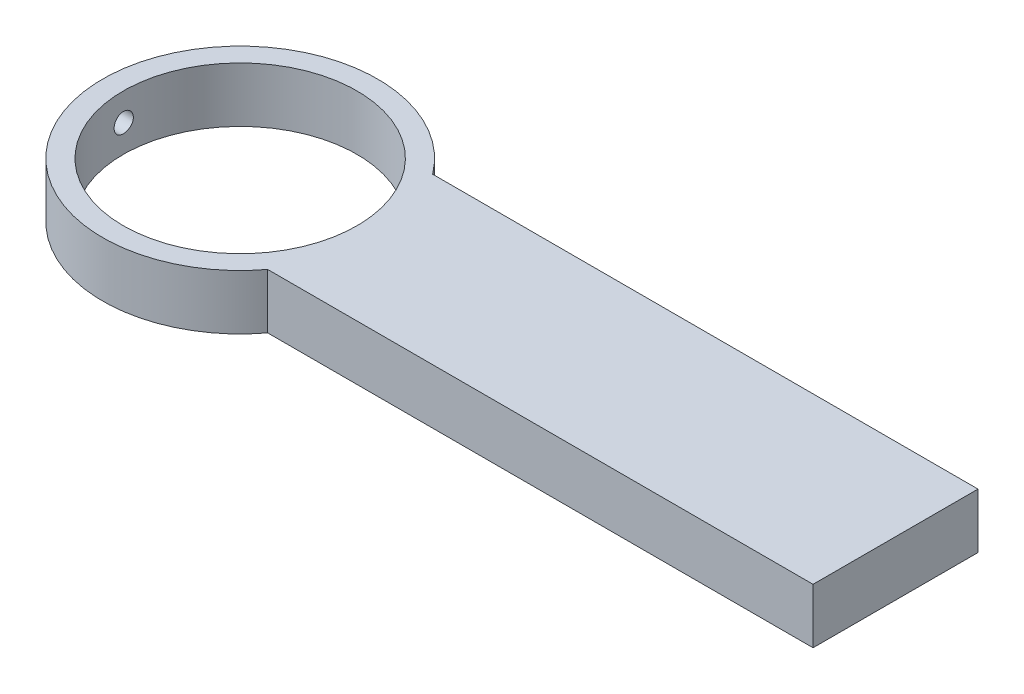
ISO-10303-21;
HEADER;
FILE_DESCRIPTION(('STEP AP214'),'2;1');
FILE_NAME('part.step','',(''),(''),'','','');
FILE_SCHEMA(('AUTOMOTIVE_DESIGN { 1 0 10303 214 1 1 1 1 }'));
ENDSEC;
DATA;
#1=APPLICATION_CONTEXT('core data for automotive mechanical design processes');
#2=APPLICATION_PROTOCOL_DEFINITION('international standard','automotive_design',2000,#1);
#3=PRODUCT_CONTEXT('',#1,'mechanical');
#4=PRODUCT('Part','Part','',(#3));
#5=PRODUCT_RELATED_PRODUCT_CATEGORY('part','',(#4));
#6=PRODUCT_DEFINITION_FORMATION('','',#4);
#7=PRODUCT_DEFINITION_CONTEXT('part definition',#1,'design');
#8=PRODUCT_DEFINITION('design','',#6,#7);
#9=PRODUCT_DEFINITION_SHAPE('','',#8);
#10=(LENGTH_UNIT() NAMED_UNIT(*) SI_UNIT(.MILLI.,.METRE.));
#11=(NAMED_UNIT(*) PLANE_ANGLE_UNIT() SI_UNIT($,.RADIAN.));
#12=(NAMED_UNIT(*) SI_UNIT($,.STERADIAN.) SOLID_ANGLE_UNIT());
#13=UNCERTAINTY_MEASURE_WITH_UNIT(LENGTH_MEASURE(1.E-05),#10,'distance_accuracy_value','');
#14=(GEOMETRIC_REPRESENTATION_CONTEXT(3) GLOBAL_UNCERTAINTY_ASSIGNED_CONTEXT((#13)) GLOBAL_UNIT_ASSIGNED_CONTEXT((#10,
#11,#12)) REPRESENTATION_CONTEXT('',''));
#15=CARTESIAN_POINT('',(0.,0.,0.));
#16=DIRECTION('',(0.,0.,1.));
#17=DIRECTION('',(1.,0.,0.));
#18=AXIS2_PLACEMENT_3D('',#15,#16,#17);
#19=CARTESIAN_POINT('',(0.,-10.,0.));
#20=DIRECTION('',(0.,1.,0.));
#21=DIRECTION('',(0.,0.,1.));
#22=AXIS2_PLACEMENT_3D('',#19,#20,#21);
#23=CYLINDRICAL_SURFACE('',#22,42.5);
#24=CARTESIAN_POINT('',(-42.3556371690948,0.,3.5));
#25=CARTESIAN_POINT('',(-42.3556390824974,-0.196238562845595,3.49999142396466));
#26=CARTESIAN_POINT('',(-42.3570156431992,-0.392610925565576,3.48344037676546));
#27=CARTESIAN_POINT('',(-42.362373136931,-0.779922876674009,3.41765842155794));
#28=CARTESIAN_POINT('',(-42.3663570251593,-0.970856043611473,3.36839043056702));
#29=CARTESIAN_POINT('',(-42.3764749055132,-1.34162393102458,3.23860861566859));
#30=CARTESIAN_POINT('',(-42.3826076829928,-1.52146485392668,3.15811244054555));
#31=CARTESIAN_POINT('',(-42.3963308123219,-1.8650395927381,2.9681904928212));
#32=CARTESIAN_POINT('',(-42.4039208512832,-2.0287768548663,2.85877092845301));
#33=CARTESIAN_POINT('',(-42.419724696405,-2.33595043375593,2.61381126613576));
#34=CARTESIAN_POINT('',(-42.4279398531564,-2.47934076017376,2.47821357933678));
#35=CARTESIAN_POINT('',(-42.4440559131641,-2.74135510608754,2.18486852075023));
#36=CARTESIAN_POINT('',(-42.4519568027125,-2.85997804621193,2.02712018413027));
#37=CARTESIAN_POINT('',(-42.4665668581017,-3.06924288660358,1.69367801019659));
#38=CARTESIAN_POINT('',(-42.4732743263355,-3.15984506118019,1.5179591607319));
#39=CARTESIAN_POINT('',(-42.484727249011,-3.31024239322861,1.15373848914464));
#40=CARTESIAN_POINT('',(-42.4894727370792,-3.37003807869987,0.96523688617128));
#41=CARTESIAN_POINT('',(-42.496457577203,-3.45699285033513,0.581258796771895));
#42=CARTESIAN_POINT('',(-42.4987026354703,-3.48422625712401,0.385799246257355));
#43=CARTESIAN_POINT('',(-42.50045298983,-3.50551315243999,-0.00692857381950516));
#44=CARTESIAN_POINT('',(-42.4999583358006,-3.49956724501707,-0.204196810388299));
#45=CARTESIAN_POINT('',(-42.4962897108242,-3.45472510313356,-0.594438373880778));
#46=CARTESIAN_POINT('',(-42.4931222387046,-3.4159087906562,-0.787420954125839));
#47=CARTESIAN_POINT('',(-42.4844717400003,-3.3065519496229,-1.16412243392015));
#48=CARTESIAN_POINT('',(-42.4789886918215,-3.23601112521537,-1.34784124706101));
#49=CARTESIAN_POINT('',(-42.4663127361263,-3.06511850444177,-1.70105452805894));
#50=CARTESIAN_POINT('',(-42.45911777639,-2.9647308917579,-1.87053159053581));
#51=CARTESIAN_POINT('',(-42.4438266196338,-2.73702033879631,-2.19026056185741));
#52=CARTESIAN_POINT('',(-42.4357304047691,-2.60969686514175,-2.34051208990859));
#53=CARTESIAN_POINT('',(-42.4195183197154,-2.33127834104207,-2.61799215487233));
#54=CARTESIAN_POINT('',(-42.4114024625222,-2.18011384764526,-2.74515102506004));
#55=CARTESIAN_POINT('',(-42.3960899915867,-1.85854636547038,-2.97229802875737));
#56=CARTESIAN_POINT('',(-42.3888933785767,-1.68814336136661,-3.07228614062213));
#57=CARTESIAN_POINT('',(-42.3762328603373,-1.33288730553243,-3.24225055734327));
#58=CARTESIAN_POINT('',(-42.370769161768,-1.14803253361871,-3.31222328304051));
#59=CARTESIAN_POINT('',(-42.362197054903,-0.769143466624365,-3.42011926500076));
#60=CARTESIAN_POINT('',(-42.3590885982647,-0.575109360041203,-3.45804317908412));
#61=CARTESIAN_POINT('',(-42.3555867233006,-0.183979053756242,-3.50067689798851));
#62=CARTESIAN_POINT('',(-42.3551853649273,0.0131064900730952,-3.5054838373549));
#63=CARTESIAN_POINT('',(-42.3571221697015,0.405280620107081,-3.48200156342021));
#64=CARTESIAN_POINT('',(-42.3594603079033,0.600369224479478,-3.45371265148891));
#65=CARTESIAN_POINT('',(-42.3666054134299,0.982732990111803,-3.36492265556402));
#66=CARTESIAN_POINT('',(-42.3714089086124,1.17001874069163,-3.30446687014621));
#67=CARTESIAN_POINT('',(-42.3829406074212,1.53178840225704,-3.15310528681497));
#68=CARTESIAN_POINT('',(-42.3896688412201,1.70627211250188,-3.06219901155092));
#69=CARTESIAN_POINT('',(-42.404311157744,2.03792932526735,-2.85227102392097));
#70=CARTESIAN_POINT('',(-42.4122279557951,2.19506172315144,-2.73318456414984));
#71=CARTESIAN_POINT('',(-42.4283461700472,2.48714053384217,-2.47037018473524));
#72=CARTESIAN_POINT('',(-42.4365475910306,2.62208657365889,-2.32664185090348));
#73=CARTESIAN_POINT('',(-42.452334570173,2.86629341331444,-2.01820398520797));
#74=CARTESIAN_POINT('',(-42.4599185862065,2.97549111565586,-1.85344440588786));
#75=CARTESIAN_POINT('',(-42.473594012699,3.16466868475902,-1.50787045966564));
#76=CARTESIAN_POINT('',(-42.479685437773,3.24464883761565,-1.32705624999017));
#77=CARTESIAN_POINT('',(-42.4896822310036,3.37301252936571,-0.954732104171518));
#78=CARTESIAN_POINT('',(-42.4935903012304,3.42143513558017,-0.76323571247486));
#79=CARTESIAN_POINT('',(-42.498791011139,3.48543688762004,-0.374797175975395));
#80=CARTESIAN_POINT('',(-42.5000836990535,3.50101663913003,-0.177855131668619));
#81=CARTESIAN_POINT('',(-42.4999080717487,3.49888343501126,0.215262150395222));
#82=CARTESIAN_POINT('',(-42.4984479133168,3.48126883556045,0.411437933017631));
#83=CARTESIAN_POINT('',(-42.4929467994317,3.4134519866711,0.798035003218843));
#84=CARTESIAN_POINT('',(-42.4889058404068,3.36324969213241,0.988456282833247));
#85=CARTESIAN_POINT('',(-42.4786965662692,3.23170737688277,1.35814578352328));
#86=CARTESIAN_POINT('',(-42.4725283675252,3.15036905941142,1.53741461404989));
#87=CARTESIAN_POINT('',(-42.4587548115147,2.95887495442643,1.87976808217458));
#88=CARTESIAN_POINT('',(-42.4511494777461,2.84871963807198,2.04285298432047));
#89=CARTESIAN_POINT('',(-42.4353285594405,2.60234937998688,2.34871243994366));
#90=CARTESIAN_POINT('',(-42.4271113117974,2.4660617059626,2.49142832104243));
#91=CARTESIAN_POINT('',(-42.4110068308549,2.17142575586439,2.75201616144308));
#92=CARTESIAN_POINT('',(-42.4031196780042,2.01307214226619,2.86988209241011));
#93=CARTESIAN_POINT('',(-42.3885526526316,1.67849888435527,3.07757984890701));
#94=CARTESIAN_POINT('',(-42.3818750270933,1.50224691825686,3.16735971831249));
#95=CARTESIAN_POINT('',(-42.3705105970598,1.13723578384829,3.31593660476885));
#96=CARTESIAN_POINT('',(-42.3658215026415,0.948491292773664,3.3747692784103));
#97=CARTESIAN_POINT('',(-42.3601722277646,0.632192517404193,3.44478130227619));
#98=CARTESIAN_POINT('',(-42.3584793868734,0.506673085525699,3.46546082815173));
#99=CARTESIAN_POINT('',(-42.3562112394166,0.254121139050789,3.49307293607272));
#100=CARTESIAN_POINT('',(-42.355635929931,0.127088628408904,3.50000555403868));
#101=CARTESIAN_POINT('',(-42.3556371690948,0.,3.5));
#102=B_SPLINE_CURVE_WITH_KNOTS('',3,(#24,#25,#26,#27,#28,#29,#30,#31,#32,#33,#34,#35,#36,#37,
#38,#39,#40,#41,#42,#43,#44,#45,#46,#47,#48,#49,#50,#51,#52,#53,#54,#55,#56,#57,#58,#59,#60,#61,
#62,#63,#64,#65,#66,#67,#68,#69,#70,#71,#72,#73,#74,#75,#76,#77,#78,#79,#80,#81,#82,#83,#84,#85,
#86,#87,#88,#89,#90,#91,#92,#93,#94,#95,#96,#97,#98,#99,#100,#101),.UNSPECIFIED.,.T.,.F.,(4,2,2,
2,2,2,2,2,2,2,2,2,2,2,2,2,2,2,2,2,2,2,2,2,2,2,2,2,2,2,2,2,2,2,2,2,2,2,4),(0.,0.588251667803966,
1.17717122943579,1.76575844358384,2.35421942343748,2.94399001266809,3.53378629895001,
4.1244149601432,4.71503349808014,5.30430141048681,5.89355859494112,6.48138714386103,
7.06922117477629,7.65776347675657,8.24631743398799,8.83661848805551,9.4269200123695,
10.0172919071315,10.6076516838755,11.1962791515735,11.7849012592901,12.3726966330962,
12.9605012217826,13.5496697057033,14.1388480935223,14.7294556241908,15.3200573715435,
15.9099265752769,16.4997849006074,17.0878981999208,17.6760123131628,18.2640942592867,
18.852166590846,19.4419000639927,20.0317764360423,20.6227376485765,21.2130164705687,
21.5939828407073,21.9749482153838),.UNSPECIFIED.);
#103=CARTESIAN_POINT('',(-42.3556371690948,0.,3.5));
#104=VERTEX_POINT('',#103);
#105=EDGE_CURVE('E153',#104,#104,#102,.T.);
#106=ORIENTED_EDGE('',*,*,#105,.F.);
#107=EDGE_LOOP('',(#106));
#108=FACE_BOUND('',#107,.T.);
#109=CARTESIAN_POINT('',(0.,-10.,0.));
#110=DIRECTION('',(0.,1.,0.));
#111=DIRECTION('',(0.,0.,1.));
#112=AXIS2_PLACEMENT_3D('',#109,#110,#111);
#113=CIRCLE('',#112,42.5);
#114=CARTESIAN_POINT('',(0.,-10.,42.5));
#115=VERTEX_POINT('',#114);
#116=EDGE_CURVE('E96',#115,#115,#113,.T.);
#117=ORIENTED_EDGE('',*,*,#116,.F.);
#118=EDGE_LOOP('',(#117));
#119=FACE_BOUND('',#118,.T.);
#120=CARTESIAN_POINT('',(0.,10.,0.));
#121=DIRECTION('',(0.,1.,0.));
#122=DIRECTION('',(0.,0.,1.));
#123=AXIS2_PLACEMENT_3D('',#120,#121,#122);
#124=CIRCLE('',#123,42.5);
#125=CARTESIAN_POINT('',(0.,10.,42.5));
#126=VERTEX_POINT('',#125);
#127=EDGE_CURVE('E115',#126,#126,#124,.T.);
#128=ORIENTED_EDGE('',*,*,#127,.T.);
#129=EDGE_LOOP('',(#128));
#130=FACE_BOUND('',#129,.T.);
#131=CARTESIAN_POINT('',(42.3556371690948,0.,-3.5));
#132=CARTESIAN_POINT('',(42.3556390824974,0.196238562845595,-3.49999142396466));
#133=CARTESIAN_POINT('',(42.3570156431992,0.392610925565576,-3.48344037676546));
#134=CARTESIAN_POINT('',(42.362373136931,0.779922876674009,-3.41765842155794));
#135=CARTESIAN_POINT('',(42.3663570251593,0.970856043611473,-3.36839043056702));
#136=CARTESIAN_POINT('',(42.3764749055132,1.34162393102458,-3.23860861566859));
#137=CARTESIAN_POINT('',(42.3826076829928,1.52146485392668,-3.15811244054555));
#138=CARTESIAN_POINT('',(42.3963308123219,1.8650395927381,-2.9681904928212));
#139=CARTESIAN_POINT('',(42.4039208512832,2.0287768548663,-2.85877092845301));
#140=CARTESIAN_POINT('',(42.419724696405,2.33595043375593,-2.61381126613576));
#141=CARTESIAN_POINT('',(42.4279398531564,2.47934076017376,-2.47821357933678));
#142=CARTESIAN_POINT('',(42.4440559131641,2.74135510608754,-2.18486852075023));
#143=CARTESIAN_POINT('',(42.4519568027125,2.85997804621193,-2.02712018413027));
#144=CARTESIAN_POINT('',(42.4665668581017,3.06924288660358,-1.69367801019659));
#145=CARTESIAN_POINT('',(42.4732743263355,3.15984506118019,-1.5179591607319));
#146=CARTESIAN_POINT('',(42.484727249011,3.31024239322861,-1.15373848914464));
#147=CARTESIAN_POINT('',(42.4894727370792,3.37003807869987,-0.96523688617128));
#148=CARTESIAN_POINT('',(42.496457577203,3.45699285033513,-0.581258796771895));
#149=CARTESIAN_POINT('',(42.4987026354703,3.48422625712401,-0.385799246257355));
#150=CARTESIAN_POINT('',(42.50045298983,3.50551315243999,0.00692857381950516));
#151=CARTESIAN_POINT('',(42.4999583358006,3.49956724501707,0.204196810388299));
#152=CARTESIAN_POINT('',(42.4962897108242,3.45472510313356,0.594438373880778));
#153=CARTESIAN_POINT('',(42.4931222387046,3.4159087906562,0.787420954125839));
#154=CARTESIAN_POINT('',(42.4844717400003,3.3065519496229,1.16412243392015));
#155=CARTESIAN_POINT('',(42.4789886918215,3.23601112521537,1.34784124706101));
#156=CARTESIAN_POINT('',(42.4663127361263,3.06511850444177,1.70105452805894));
#157=CARTESIAN_POINT('',(42.45911777639,2.9647308917579,1.87053159053581));
#158=CARTESIAN_POINT('',(42.4438266196338,2.73702033879631,2.19026056185741));
#159=CARTESIAN_POINT('',(42.4357304047691,2.60969686514175,2.34051208990859));
#160=CARTESIAN_POINT('',(42.4195183197154,2.33127834104207,2.61799215487233));
#161=CARTESIAN_POINT('',(42.4114024625222,2.18011384764526,2.74515102506004));
#162=CARTESIAN_POINT('',(42.3960899915867,1.85854636547038,2.97229802875737));
#163=CARTESIAN_POINT('',(42.3888933785767,1.68814336136661,3.07228614062213));
#164=CARTESIAN_POINT('',(42.3762328603373,1.33288730553243,3.24225055734327));
#165=CARTESIAN_POINT('',(42.370769161768,1.14803253361871,3.31222328304051));
#166=CARTESIAN_POINT('',(42.362197054903,0.769143466624365,3.42011926500076));
#167=CARTESIAN_POINT('',(42.3590885982647,0.575109360041203,3.45804317908412));
#168=CARTESIAN_POINT('',(42.3555867233006,0.183979053756242,3.50067689798851));
#169=CARTESIAN_POINT('',(42.3551853649273,-0.0131064900730952,3.5054838373549));
#170=CARTESIAN_POINT('',(42.3571221697015,-0.405280620107081,3.48200156342021));
#171=CARTESIAN_POINT('',(42.3594603079033,-0.600369224479478,3.45371265148891));
#172=CARTESIAN_POINT('',(42.3666054134299,-0.982732990111803,3.36492265556402));
#173=CARTESIAN_POINT('',(42.3714089086124,-1.17001874069163,3.30446687014621));
#174=CARTESIAN_POINT('',(42.3829406074212,-1.53178840225704,3.15310528681497));
#175=CARTESIAN_POINT('',(42.3896688412201,-1.70627211250188,3.06219901155092));
#176=CARTESIAN_POINT('',(42.404311157744,-2.03792932526735,2.85227102392097));
#177=CARTESIAN_POINT('',(42.4122279557951,-2.19506172315144,2.73318456414984));
#178=CARTESIAN_POINT('',(42.4283461700472,-2.48714053384217,2.47037018473524));
#179=CARTESIAN_POINT('',(42.4365475910306,-2.62208657365889,2.32664185090348));
#180=CARTESIAN_POINT('',(42.452334570173,-2.86629341331444,2.01820398520797));
#181=CARTESIAN_POINT('',(42.4599185862065,-2.97549111565586,1.85344440588786));
#182=CARTESIAN_POINT('',(42.473594012699,-3.16466868475902,1.50787045966564));
#183=CARTESIAN_POINT('',(42.479685437773,-3.24464883761565,1.32705624999017));
#184=CARTESIAN_POINT('',(42.4896822310036,-3.37301252936571,0.954732104171518));
#185=CARTESIAN_POINT('',(42.4935903012304,-3.42143513558017,0.76323571247486));
#186=CARTESIAN_POINT('',(42.498791011139,-3.48543688762004,0.374797175975395));
#187=CARTESIAN_POINT('',(42.5000836990535,-3.50101663913003,0.177855131668619));
#188=CARTESIAN_POINT('',(42.4999080717487,-3.49888343501126,-0.215262150395222));
#189=CARTESIAN_POINT('',(42.4984479133168,-3.48126883556045,-0.411437933017631));
#190=CARTESIAN_POINT('',(42.4929467994317,-3.4134519866711,-0.798035003218843));
#191=CARTESIAN_POINT('',(42.4889058404068,-3.36324969213241,-0.988456282833247));
#192=CARTESIAN_POINT('',(42.4786965662692,-3.23170737688277,-1.35814578352328));
#193=CARTESIAN_POINT('',(42.4725283675252,-3.15036905941142,-1.53741461404989));
#194=CARTESIAN_POINT('',(42.4587548115147,-2.95887495442643,-1.87976808217458));
#195=CARTESIAN_POINT('',(42.4511494777461,-2.84871963807198,-2.04285298432047));
#196=CARTESIAN_POINT('',(42.4353285594405,-2.60234937998688,-2.34871243994366));
#197=CARTESIAN_POINT('',(42.4271113117974,-2.4660617059626,-2.49142832104243));
#198=CARTESIAN_POINT('',(42.4110068308549,-2.17142575586439,-2.75201616144308));
#199=CARTESIAN_POINT('',(42.4031196780042,-2.01307214226619,-2.86988209241011));
#200=CARTESIAN_POINT('',(42.3885526526316,-1.67849888435527,-3.07757984890701));
#201=CARTESIAN_POINT('',(42.3818750270933,-1.50224691825686,-3.16735971831249));
#202=CARTESIAN_POINT('',(42.3705105970598,-1.13723578384829,-3.31593660476885));
#203=CARTESIAN_POINT('',(42.3658215026415,-0.948491292773664,-3.3747692784103));
#204=CARTESIAN_POINT('',(42.3601722277646,-0.632192517404193,-3.44478130227619));
#205=CARTESIAN_POINT('',(42.3584793868734,-0.506673085525699,-3.46546082815173));
#206=CARTESIAN_POINT('',(42.3562112394166,-0.254121139050789,-3.49307293607272));
#207=CARTESIAN_POINT('',(42.355635929931,-0.127088628408904,-3.50000555403868));
#208=CARTESIAN_POINT('',(42.3556371690948,0.,-3.5));
#209=B_SPLINE_CURVE_WITH_KNOTS('',3,(#131,#132,#133,#134,#135,#136,#137,#138,#139,#140,#141,
#142,#143,#144,#145,#146,#147,#148,#149,#150,#151,#152,#153,#154,#155,#156,#157,#158,#159,#160,
#161,#162,#163,#164,#165,#166,#167,#168,#169,#170,#171,#172,#173,#174,#175,#176,#177,#178,#179,
#180,#181,#182,#183,#184,#185,#186,#187,#188,#189,#190,#191,#192,#193,#194,#195,#196,#197,#198,
#199,#200,#201,#202,#203,#204,#205,#206,#207,#208),.UNSPECIFIED.,.T.,.F.,(4,2,2,2,2,2,2,2,2,2,2,
2,2,2,2,2,2,2,2,2,2,2,2,2,2,2,2,2,2,2,2,2,2,2,2,2,2,2,4),(0.,0.588251667803966,1.17717122943579,
1.76575844358384,2.35421942343748,2.94399001266809,3.53378629895001,4.1244149601432,
4.71503349808014,5.30430141048681,5.89355859494112,6.48138714386103,7.06922117477629,
7.65776347675657,8.24631743398799,8.83661848805551,9.4269200123695,10.0172919071315,
10.6076516838755,11.1962791515735,11.7849012592901,12.3726966330962,12.9605012217826,
13.5496697057033,14.1388480935223,14.7294556241908,15.3200573715435,15.9099265752769,
16.4997849006074,17.0878981999208,17.6760123131628,18.2640942592867,18.852166590846,
19.4419000639927,20.0317764360423,20.6227376485765,21.2130164705687,21.5939828407073,
21.9749482153838),.UNSPECIFIED.);
#210=CARTESIAN_POINT('',(42.3556371690948,0.,-3.5));
#211=VERTEX_POINT('',#210);
#212=EDGE_CURVE('E148',#211,#211,#209,.T.);
#213=ORIENTED_EDGE('',*,*,#212,.T.);
#214=EDGE_LOOP('',(#213));
#215=FACE_BOUND('',#214,.T.);
#216=ADVANCED_FACE('F43',(#108,#119,#130,#215),#23,.F.);
#217=CARTESIAN_POINT('',(238.383087675041,-10.,0.));
#218=DIRECTION('',(1.,0.,0.));
#219=DIRECTION('',(0.,0.,-1.));
#220=AXIS2_PLACEMENT_3D('',#217,#218,#219);
#221=PLANE('',#220);
#222=DIRECTION('',(0.,1.,0.));
#223=VECTOR('',#222,1.);
#224=CARTESIAN_POINT('',(238.383087675041,-10.,-30.));
#225=LINE('',#224,#223);
#226=CARTESIAN_POINT('',(238.383087675041,-10.,-30.));
#227=VERTEX_POINT('',#226);
#228=CARTESIAN_POINT('',(238.383087675041,10.,-30.));
#229=VERTEX_POINT('',#228);
#230=EDGE_CURVE('E88',#227,#229,#225,.T.);
#231=ORIENTED_EDGE('',*,*,#230,.T.);
#232=DIRECTION('',(0.,0.,-1.));
#233=VECTOR('',#232,1.);
#234=CARTESIAN_POINT('',(238.383087675041,10.,0.));
#235=LINE('',#234,#233);
#236=CARTESIAN_POINT('',(238.383087675041,10.,30.));
#237=VERTEX_POINT('',#236);
#238=EDGE_CURVE('E90',#237,#229,#235,.T.);
#239=ORIENTED_EDGE('',*,*,#238,.F.);
#240=DIRECTION('',(0.,1.,0.));
#241=VECTOR('',#240,1.);
#242=CARTESIAN_POINT('',(238.383087675041,-10.,30.));
#243=LINE('',#242,#241);
#244=CARTESIAN_POINT('',(238.383087675041,-10.,30.));
#245=VERTEX_POINT('',#244);
#246=EDGE_CURVE('E11',#245,#237,#243,.T.);
#247=ORIENTED_EDGE('',*,*,#246,.F.);
#248=DIRECTION('',(0.,0.,-1.));
#249=VECTOR('',#248,1.);
#250=CARTESIAN_POINT('',(238.383087675041,-10.,0.));
#251=LINE('',#250,#249);
#252=EDGE_CURVE('E91',#245,#227,#251,.T.);
#253=ORIENTED_EDGE('',*,*,#252,.T.);
#254=EDGE_LOOP('',(#231,#239,#247,#253));
#255=FACE_BOUND('',#254,.T.);
#256=ADVANCED_FACE('F45',(#255),#221,.T.);
#257=CARTESIAN_POINT('',(0.,-10.,30.));
#258=DIRECTION('',(0.,0.,1.));
#259=DIRECTION('',(1.,0.,0.));
#260=AXIS2_PLACEMENT_3D('',#257,#258,#259);
#261=PLANE('',#260);
#262=ORIENTED_EDGE('',*,*,#246,.T.);
#263=DIRECTION('',(1.,0.,0.));
#264=VECTOR('',#263,1.);
#265=CARTESIAN_POINT('',(0.,10.,30.));
#266=LINE('',#265,#264);
#267=CARTESIAN_POINT('',(40.,10.,30.));
#268=VERTEX_POINT('',#267);
#269=EDGE_CURVE('E104',#268,#237,#266,.T.);
#270=ORIENTED_EDGE('',*,*,#269,.F.);
#271=DIRECTION('',(0.,1.,0.));
#272=VECTOR('',#271,1.);
#273=CARTESIAN_POINT('',(40.,-10.,30.));
#274=LINE('',#273,#272);
#275=CARTESIAN_POINT('',(40.,-10.,30.));
#276=VERTEX_POINT('',#275);
#277=EDGE_CURVE('E57',#276,#268,#274,.T.);
#278=ORIENTED_EDGE('',*,*,#277,.F.);
#279=DIRECTION('',(1.,0.,0.));
#280=VECTOR('',#279,1.);
#281=CARTESIAN_POINT('',(0.,-10.,30.));
#282=LINE('',#281,#280);
#283=EDGE_CURVE('E123',#276,#245,#282,.T.);
#284=ORIENTED_EDGE('',*,*,#283,.T.);
#285=EDGE_LOOP('',(#262,#270,#278,#284));
#286=FACE_BOUND('',#285,.T.);
#287=ADVANCED_FACE('F132',(#286),#261,.T.);
#288=CARTESIAN_POINT('',(0.,-10.,0.));
#289=DIRECTION('',(0.,1.,0.));
#290=DIRECTION('',(0.,0.,1.));
#291=AXIS2_PLACEMENT_3D('',#288,#289,#290);
#292=CYLINDRICAL_SURFACE('',#291,50.);
#293=CARTESIAN_POINT('',(-49.8773495687171,0.,3.5));
#294=CARTESIAN_POINT('',(-49.8773512044963,0.196337967109832,3.49999138017212));
#295=CARTESIAN_POINT('',(-49.8785213418936,0.3928121645192,3.48342363444229));
#296=CARTESIAN_POINT('',(-49.8830758130885,0.780331809735319,3.41757146491605));
#297=CARTESIAN_POINT('',(-49.8864627016937,0.97137072796996,3.36824929065263));
#298=CARTESIAN_POINT('',(-49.8950651816424,1.34235067619755,3.23831511853374));
#299=CARTESIAN_POINT('',(-49.9002797841856,1.52229764520442,3.15772003692143));
#300=CARTESIAN_POINT('',(-49.9119488841528,1.86606356854171,2.96755614329887));
#301=CARTESIAN_POINT('',(-49.9184031037511,2.02988612429271,2.85799382142466));
#302=CARTESIAN_POINT('',(-49.9318376744177,2.33710181482178,2.61278459079358));
#303=CARTESIAN_POINT('',(-49.9388188691951,2.48046107894005,2.47709528904635));
#304=CARTESIAN_POINT('',(-49.9525129764347,2.74239042786781,2.18357227450859));
#305=CARTESIAN_POINT('',(-49.9592258775255,2.86095946285925,2.02573762437835));
#306=CARTESIAN_POINT('',(-49.9716345908384,3.07005006695007,1.69220885113593));
#307=CARTESIAN_POINT('',(-49.9773293664588,3.1605431187049,1.51649680851785));
#308=CARTESIAN_POINT('',(-49.9870512003765,3.31073048875111,1.15232650850269));
#309=CARTESIAN_POINT('',(-49.9910782802274,3.37042520508776,0.963868415874294));
#310=CARTESIAN_POINT('',(-49.9970051188361,3.45722605715289,0.579886210850923));
#311=CARTESIAN_POINT('',(-49.9989083850636,3.48438592951584,0.384374300847736));
#312=CARTESIAN_POINT('',(-50.0003849868549,3.50551213001937,-0.0084419700609818));
#313=CARTESIAN_POINT('',(-49.9999583542714,3.49947891195261,-0.205746306424901));
#314=CARTESIAN_POINT('',(-49.9968261446792,3.45443438715949,-0.596182583155041));
#315=CARTESIAN_POINT('',(-49.9941245616964,3.41548087664569,-0.789321227941275));
#316=CARTESIAN_POINT('',(-49.986751105506,3.30579126303607,-1.16631187270639));
#317=CARTESIAN_POINT('',(-49.9820792182968,3.23505493407969,-1.35016380668012));
#318=CARTESIAN_POINT('',(-49.9712841538451,3.06374251828847,-1.70354716268004));
#319=CARTESIAN_POINT('',(-49.9651597085618,2.96314034001506,-1.87306589585231));
#320=CARTESIAN_POINT('',(-49.9521484613148,2.73497091676806,-2.19283229585824));
#321=CARTESIAN_POINT('',(-49.9452616485181,2.60740328859778,-2.34307968878479));
#322=CARTESIAN_POINT('',(-49.9314829333014,2.32859794224701,-2.62037596464136));
#323=CARTESIAN_POINT('',(-49.9245910516482,2.17731004087995,-2.74737439775906));
#324=CARTESIAN_POINT('',(-49.9115939336943,1.85553416513557,-2.97417850420798));
#325=CARTESIAN_POINT('',(-49.9054886977995,1.68504618084863,-3.07398416350428));
#326=CARTESIAN_POINT('',(-49.8947545526041,1.32967649862893,-3.2435665617334));
#327=CARTESIAN_POINT('',(-49.890125755705,1.14479370615071,-3.31334101452945));
#328=CARTESIAN_POINT('',(-49.882870303997,0.765897967313672,-3.42084470677291));
#329=CARTESIAN_POINT('',(-49.8802436195996,0.571885155929083,-3.45857441979887));
#330=CARTESIAN_POINT('',(-49.8772941903426,0.180677208912331,-3.50085444037696));
#331=CARTESIAN_POINT('',(-49.8769665707995,-0.0165103044883283,-3.50547494947156));
#332=CARTESIAN_POINT('',(-49.8786394758944,-0.408857393080379,-3.48158897766338));
#333=CARTESIAN_POINT('',(-49.8806399852873,-0.60401698154267,-3.4530827136827));
#334=CARTESIAN_POINT('',(-49.8867392692123,-0.986568854649188,-3.36381076757937));
#335=CARTESIAN_POINT('',(-49.8908359314969,-1.17396875347632,-3.30307755756909));
#336=CARTESIAN_POINT('',(-49.9006641101939,-1.53591694927938,-3.15110864039777));
#337=CARTESIAN_POINT('',(-49.9063956451912,-1.71046510013101,-3.05987258648492));
#338=CARTESIAN_POINT('',(-49.9188595394281,-2.04207709063049,-2.84930901636196));
#339=CARTESIAN_POINT('',(-49.9255935645271,-2.19911105199874,-2.72993454556145));
#340=CARTESIAN_POINT('',(-49.9392978585072,-2.49093573943957,-2.4665509104117));
#341=CARTESIAN_POINT('',(-49.9462681302713,-2.62572619395101,-2.3225414453484));
#342=CARTESIAN_POINT('',(-49.959673848412,-2.86947560847665,-2.01367317861251));
#343=CARTESIAN_POINT('',(-49.9661083402567,-2.97838908035359,-1.84877843201467));
#344=CARTESIAN_POINT('',(-49.9777037623003,-3.16698133789833,-1.50300056166708));
#345=CARTESIAN_POINT('',(-49.9828647019664,-3.24666034089045,-1.32211755678387));
#346=CARTESIAN_POINT('',(-49.991327019617,-3.37444306683983,-0.949663615961584));
#347=CARTESIAN_POINT('',(-49.9946300799261,-3.42257536214371,-0.758102522469185));
#348=CARTESIAN_POINT('',(-49.9990112218645,-3.48599184018311,-0.369593895439547));
#349=CARTESIAN_POINT('',(-50.0000893319915,-3.50127644364013,-0.172646430925024));
#350=CARTESIAN_POINT('',(-49.9998991736435,-3.49855934974482,0.220594730995418));
#351=CARTESIAN_POINT('',(-49.9986359162003,-3.48062874016053,0.416888925947944));
#352=CARTESIAN_POINT('',(-49.9939149646796,-3.41213787881564,0.803671738799624));
#353=CARTESIAN_POINT('',(-49.9904572669893,-3.36157757333334,0.994160347139892));
#354=CARTESIAN_POINT('',(-49.9817358399979,-3.22927932254464,1.3639332426134));
#355=CARTESIAN_POINT('',(-49.9764721483082,-3.14754202652009,1.54321776298884));
#356=CARTESIAN_POINT('',(-49.9647290321308,-2.95521910031501,1.88552933016287));
#357=CARTESIAN_POINT('',(-49.958249635124,-2.84463412220999,2.04855674432338));
#358=CARTESIAN_POINT('',(-49.9447869306355,-2.59748999888006,2.35408850759354));
#359=CARTESIAN_POINT('',(-49.9378026326345,-2.46087888737084,2.49655077663273));
#360=CARTESIAN_POINT('',(-49.9241254921026,-2.16564126946744,2.75657317372269));
#361=CARTESIAN_POINT('',(-49.9174327210616,-2.00700940250855,2.87412722064897));
#362=CARTESIAN_POINT('',(-49.9050857417343,-1.67201115413591,3.08110643312639));
#363=CARTESIAN_POINT('',(-49.899433047552,-1.49561948727489,3.17049072297035));
#364=CARTESIAN_POINT('',(-49.8898252619714,-1.13041819666969,3.31826310442802));
#365=CARTESIAN_POINT('',(-49.885868195255,-0.941623319484761,3.3766872818553));
#366=CARTESIAN_POINT('',(-49.881130447554,-0.626405444308942,3.44579537587166));
#367=CARTESIAN_POINT('',(-49.8797190128627,-0.502016851812279,3.46609558617902));
#368=CARTESIAN_POINT('',(-49.8778280497596,-0.251770847299659,3.49320065012734));
#369=CARTESIAN_POINT('',(-49.877348519676,-0.125913437919175,3.50000552797902));
#370=CARTESIAN_POINT('',(-49.8773495687171,0.,3.5));
#371=B_SPLINE_CURVE_WITH_KNOTS('',3,(#293,#294,#295,#296,#297,#298,#299,#300,#301,#302,#303,
#304,#305,#306,#307,#308,#309,#310,#311,#312,#313,#314,#315,#316,#317,#318,#319,#320,#321,#322,
#323,#324,#325,#326,#327,#328,#329,#330,#331,#332,#333,#334,#335,#336,#337,#338,#339,#340,#341,
#342,#343,#344,#345,#346,#347,#348,#349,#350,#351,#352,#353,#354,#355,#356,#357,#358,#359,#360,
#361,#362,#363,#364,#365,#366,#367,#368,#369,#370),.UNSPECIFIED.,.T.,.F.,(4,2,2,2,2,2,2,2,2,2,2,
2,2,2,2,2,2,2,2,2,2,2,2,2,2,2,2,2,2,2,2,2,2,2,2,2,2,2,4),(0.,0.588554216273834,1.17778793900944,
1.76670337484306,2.35548697529841,2.94523409691631,3.53500618812313,4.12537537631882,
4.71573693424673,5.30512206277371,5.89449913366063,6.48284361445073,7.07119227630192,
7.66005645219801,8.24892899680194,8.83906461661277,9.42920054100749,10.0193813817766,
10.6095535003073,11.1984739038846,11.7873904510905,12.3757147252277,12.9640456875756,
13.5533654363642,14.1426923793652,14.7330477368474,15.3233987056342,15.9132142427062,
16.5030222252272,17.0915693487741,17.6801174413102,18.2686532776044,18.8571758117363,
19.4468860017003,20.0367399987803,20.6274460037431,21.2174619836192,21.5949081740441,
21.9723536873279),.UNSPECIFIED.);
#372=CARTESIAN_POINT('',(-49.8773495687171,0.,3.5));
#373=VERTEX_POINT('',#372);
#374=EDGE_CURVE('E47',#373,#373,#371,.T.);
#375=ORIENTED_EDGE('',*,*,#374,.F.);
#376=EDGE_LOOP('',(#375));
#377=FACE_BOUND('',#376,.T.);
#378=ORIENTED_EDGE('',*,*,#277,.T.);
#379=CARTESIAN_POINT('',(0.,10.,0.));
#380=DIRECTION('',(0.,1.,0.));
#381=DIRECTION('',(0.,0.,1.));
#382=AXIS2_PLACEMENT_3D('',#379,#380,#381);
#383=CIRCLE('',#382,50.);
#384=CARTESIAN_POINT('',(40.,10.,-30.));
#385=VERTEX_POINT('',#384);
#386=EDGE_CURVE('E109',#385,#268,#383,.T.);
#387=ORIENTED_EDGE('',*,*,#386,.F.);
#388=DIRECTION('',(0.,1.,0.));
#389=VECTOR('',#388,1.);
#390=CARTESIAN_POINT('',(40.,-10.,-30.));
#391=LINE('',#390,#389);
#392=CARTESIAN_POINT('',(40.,-10.,-30.));
#393=VERTEX_POINT('',#392);
#394=EDGE_CURVE('E95',#393,#385,#391,.T.);
#395=ORIENTED_EDGE('',*,*,#394,.F.);
#396=CARTESIAN_POINT('',(0.,-10.,0.));
#397=DIRECTION('',(0.,1.,0.));
#398=DIRECTION('',(0.,0.,1.));
#399=AXIS2_PLACEMENT_3D('',#396,#397,#398);
#400=CIRCLE('',#399,50.);
#401=EDGE_CURVE('E121',#393,#276,#400,.T.);
#402=ORIENTED_EDGE('',*,*,#401,.T.);
#403=EDGE_LOOP('',(#378,#387,#395,#402));
#404=FACE_BOUND('',#403,.T.);
#405=ADVANCED_FACE('F129',(#377,#404),#292,.T.);
#406=CARTESIAN_POINT('',(0.,-10.,-30.));
#407=DIRECTION('',(0.,0.,1.));
#408=DIRECTION('',(1.,0.,0.));
#409=AXIS2_PLACEMENT_3D('',#406,#407,#408);
#410=PLANE('',#409);
#411=ORIENTED_EDGE('',*,*,#394,.T.);
#412=DIRECTION('',(1.,0.,0.));
#413=VECTOR('',#412,1.);
#414=CARTESIAN_POINT('',(0.,10.,-30.));
#415=LINE('',#414,#413);
#416=EDGE_CURVE('E103',#385,#229,#415,.T.);
#417=ORIENTED_EDGE('',*,*,#416,.T.);
#418=ORIENTED_EDGE('',*,*,#230,.F.);
#419=DIRECTION('',(1.,0.,0.));
#420=VECTOR('',#419,1.);
#421=CARTESIAN_POINT('',(0.,-10.,-30.));
#422=LINE('',#421,#420);
#423=EDGE_CURVE('E119',#393,#227,#422,.T.);
#424=ORIENTED_EDGE('',*,*,#423,.F.);
#425=EDGE_LOOP('',(#411,#417,#418,#424));
#426=FACE_BOUND('',#425,.T.);
#427=ADVANCED_FACE('F107',(#426),#410,.F.);
#428=CARTESIAN_POINT('',(0.,-10.,0.));
#429=DIRECTION('',(0.,1.,0.));
#430=DIRECTION('',(0.,0.,1.));
#431=AXIS2_PLACEMENT_3D('',#428,#429,#430);
#432=PLANE('',#431);
#433=ORIENTED_EDGE('',*,*,#252,.F.);
#434=ORIENTED_EDGE('',*,*,#283,.F.);
#435=ORIENTED_EDGE('',*,*,#401,.F.);
#436=ORIENTED_EDGE('',*,*,#423,.T.);
#437=EDGE_LOOP('',(#433,#434,#435,#436));
#438=FACE_BOUND('',#437,.T.);
#439=ORIENTED_EDGE('',*,*,#116,.T.);
#440=EDGE_LOOP('',(#439));
#441=FACE_BOUND('',#440,.T.);
#442=ADVANCED_FACE('F134',(#438,#441),#432,.F.);
#443=CARTESIAN_POINT('',(0.,10.,0.));
#444=DIRECTION('',(0.,1.,0.));
#445=DIRECTION('',(0.,0.,1.));
#446=AXIS2_PLACEMENT_3D('',#443,#444,#445);
#447=PLANE('',#446);
#448=ORIENTED_EDGE('',*,*,#238,.T.);
#449=ORIENTED_EDGE('',*,*,#416,.F.);
#450=ORIENTED_EDGE('',*,*,#386,.T.);
#451=ORIENTED_EDGE('',*,*,#269,.T.);
#452=EDGE_LOOP('',(#448,#449,#450,#451));
#453=FACE_BOUND('',#452,.T.);
#454=ORIENTED_EDGE('',*,*,#127,.F.);
#455=EDGE_LOOP('',(#454));
#456=FACE_BOUND('',#455,.T.);
#457=ADVANCED_FACE('F100',(#453,#456),#447,.T.);
#458=CARTESIAN_POINT('',(52.5,0.,0.));
#459=DIRECTION('',(-1.,0.,0.));
#460=DIRECTION('',(0.,0.,1.));
#461=AXIS2_PLACEMENT_3D('',#458,#459,#460);
#462=PLANE('',#461);
#463=CARTESIAN_POINT('',(52.5,0.,0.));
#464=DIRECTION('',(-1.,0.,0.));
#465=DIRECTION('',(0.,0.,1.));
#466=AXIS2_PLACEMENT_3D('',#463,#464,#465);
#467=CIRCLE('',#466,3.5);
#468=CARTESIAN_POINT('',(52.5,0.,3.5));
#469=VERTEX_POINT('',#468);
#470=EDGE_CURVE('E105',#469,#469,#467,.T.);
#471=ORIENTED_EDGE('',*,*,#470,.T.);
#472=EDGE_LOOP('',(#471));
#473=FACE_BOUND('',#472,.T.);
#474=ADVANCED_FACE('F166',(#473),#462,.T.);
#475=CARTESIAN_POINT('',(-50.001,0.,0.));
#476=DIRECTION('',(1.,0.,0.));
#477=DIRECTION('',(0.,0.,-1.));
#478=AXIS2_PLACEMENT_3D('',#475,#476,#477);
#479=CYLINDRICAL_SURFACE('',#478,3.5);
#480=ORIENTED_EDGE('',*,*,#212,.F.);
#481=EDGE_LOOP('',(#480));
#482=FACE_BOUND('',#481,.T.);
#483=ORIENTED_EDGE('',*,*,#470,.F.);
#484=EDGE_LOOP('',(#483));
#485=FACE_BOUND('',#484,.T.);
#486=ADVANCED_FACE('F160',(#482,#485),#479,.F.);
#487=CARTESIAN_POINT('',(238.384087675041,0.,0.));
#488=DIRECTION('',(-1.,0.,0.));
#489=DIRECTION('',(0.,0.,1.));
#490=AXIS2_PLACEMENT_3D('',#487,#488,#489);
#491=CYLINDRICAL_SURFACE('',#490,3.5);
#492=ORIENTED_EDGE('',*,*,#374,.T.);
#493=EDGE_LOOP('',(#492));
#494=FACE_BOUND('',#493,.T.);
#495=ORIENTED_EDGE('',*,*,#105,.T.);
#496=EDGE_LOOP('',(#495));
#497=FACE_BOUND('',#496,.T.);
#498=ADVANCED_FACE('F205',(#494,#497),#491,.F.);
#499=CLOSED_SHELL('',(#216,#256,#287,#405,#427,#442,#457,#474,#486,#498));
#500=MANIFOLD_SOLID_BREP('B2',#499);
#501=ADVANCED_BREP_SHAPE_REPRESENTATION('',(#18,#500),#14);
#502=SHAPE_DEFINITION_REPRESENTATION(#9,#501);
ENDSEC;
END-ISO-10303-21;
